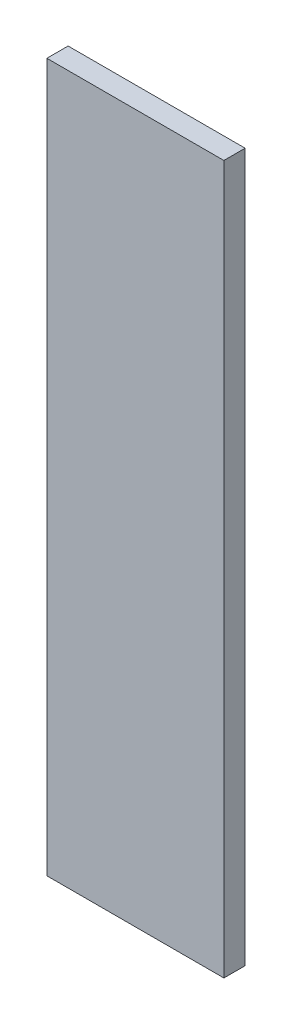
ISO-10303-21;
HEADER;
FILE_DESCRIPTION(('STEP AP214'),'2;1');
FILE_NAME('part.step','',(''),(''),'','','');
FILE_SCHEMA(('AUTOMOTIVE_DESIGN { 1 0 10303 214 1 1 1 1 }'));
ENDSEC;
DATA;
#1=APPLICATION_CONTEXT('core data for automotive mechanical design processes');
#2=APPLICATION_PROTOCOL_DEFINITION('international standard','automotive_design',2000,#1);
#3=PRODUCT_CONTEXT('',#1,'mechanical');
#4=PRODUCT('Part','Part','',(#3));
#5=PRODUCT_RELATED_PRODUCT_CATEGORY('part','',(#4));
#6=PRODUCT_DEFINITION_FORMATION('','',#4);
#7=PRODUCT_DEFINITION_CONTEXT('part definition',#1,'design');
#8=PRODUCT_DEFINITION('design','',#6,#7);
#9=PRODUCT_DEFINITION_SHAPE('','',#8);
#10=(LENGTH_UNIT() NAMED_UNIT(*) SI_UNIT(.MILLI.,.METRE.));
#11=(NAMED_UNIT(*) PLANE_ANGLE_UNIT() SI_UNIT($,.RADIAN.));
#12=(NAMED_UNIT(*) SI_UNIT($,.STERADIAN.) SOLID_ANGLE_UNIT());
#13=UNCERTAINTY_MEASURE_WITH_UNIT(LENGTH_MEASURE(1.E-05),#10,'distance_accuracy_value','');
#14=(GEOMETRIC_REPRESENTATION_CONTEXT(3) GLOBAL_UNCERTAINTY_ASSIGNED_CONTEXT((#13)) GLOBAL_UNIT_ASSIGNED_CONTEXT((#10,
#11,#12)) REPRESENTATION_CONTEXT('',''));
#15=CARTESIAN_POINT('',(0.,0.,0.));
#16=DIRECTION('',(0.,0.,1.));
#17=DIRECTION('',(1.,0.,0.));
#18=AXIS2_PLACEMENT_3D('',#15,#16,#17);
#19=CARTESIAN_POINT('',(500.,2000.,60.));
#20=DIRECTION('',(-1.,0.,0.));
#21=DIRECTION('',(0.,0.,1.));
#22=AXIS2_PLACEMENT_3D('',#19,#20,#21);
#23=PLANE('',#22);
#24=DIRECTION('',(0.,0.,-1.));
#25=VECTOR('',#24,1.);
#26=CARTESIAN_POINT('',(500.,-2000.,60.));
#27=LINE('',#26,#25);
#28=CARTESIAN_POINT('',(500.,-2000.,60.));
#29=VERTEX_POINT('',#28);
#30=CARTESIAN_POINT('',(500.,-2000.,-60.));
#31=VERTEX_POINT('',#30);
#32=EDGE_CURVE('E100',#29,#31,#27,.T.);
#33=ORIENTED_EDGE('',*,*,#32,.T.);
#34=DIRECTION('',(0.,-1.,0.));
#35=VECTOR('',#34,1.);
#36=CARTESIAN_POINT('',(500.,2000.,-60.));
#37=LINE('',#36,#35);
#38=CARTESIAN_POINT('',(500.,2000.,-60.));
#39=VERTEX_POINT('',#38);
#40=EDGE_CURVE('E11',#39,#31,#37,.T.);
#41=ORIENTED_EDGE('',*,*,#40,.F.);
#42=DIRECTION('',(0.,0.,-1.));
#43=VECTOR('',#42,1.);
#44=CARTESIAN_POINT('',(500.,2000.,60.));
#45=LINE('',#44,#43);
#46=CARTESIAN_POINT('',(500.,2000.,60.));
#47=VERTEX_POINT('',#46);
#48=EDGE_CURVE('E88',#47,#39,#45,.T.);
#49=ORIENTED_EDGE('',*,*,#48,.F.);
#50=DIRECTION('',(0.,-1.,0.));
#51=VECTOR('',#50,1.);
#52=CARTESIAN_POINT('',(500.,2000.,60.));
#53=LINE('',#52,#51);
#54=EDGE_CURVE('E96',#47,#29,#53,.T.);
#55=ORIENTED_EDGE('',*,*,#54,.T.);
#56=EDGE_LOOP('',(#33,#41,#49,#55));
#57=FACE_BOUND('',#56,.T.);
#58=ADVANCED_FACE('F37',(#57),#23,.F.);
#59=CARTESIAN_POINT('',(-500.,2000.,-60.));
#60=DIRECTION('',(0.,0.,1.));
#61=DIRECTION('',(1.,0.,0.));
#62=AXIS2_PLACEMENT_3D('',#59,#60,#61);
#63=PLANE('',#62);
#64=DIRECTION('',(-1.,0.,0.));
#65=VECTOR('',#64,1.);
#66=CARTESIAN_POINT('',(-500.,-2000.,-60.));
#67=LINE('',#66,#65);
#68=CARTESIAN_POINT('',(-500.,-2000.,-60.));
#69=VERTEX_POINT('',#68);
#70=EDGE_CURVE('E92',#31,#69,#67,.T.);
#71=ORIENTED_EDGE('',*,*,#70,.T.);
#72=DIRECTION('',(0.,-1.,0.));
#73=VECTOR('',#72,1.);
#74=CARTESIAN_POINT('',(-500.,2000.,-60.));
#75=LINE('',#74,#73);
#76=CARTESIAN_POINT('',(-500.,2000.,-60.));
#77=VERTEX_POINT('',#76);
#78=EDGE_CURVE('E45',#77,#69,#75,.T.);
#79=ORIENTED_EDGE('',*,*,#78,.F.);
#80=DIRECTION('',(-1.,0.,0.));
#81=VECTOR('',#80,1.);
#82=CARTESIAN_POINT('',(-500.,2000.,-60.));
#83=LINE('',#82,#81);
#84=EDGE_CURVE('E83',#39,#77,#83,.T.);
#85=ORIENTED_EDGE('',*,*,#84,.F.);
#86=ORIENTED_EDGE('',*,*,#40,.T.);
#87=EDGE_LOOP('',(#71,#79,#85,#86));
#88=FACE_BOUND('',#87,.T.);
#89=ADVANCED_FACE('F91',(#88),#63,.F.);
#90=CARTESIAN_POINT('',(-500.,2000.,60.));
#91=DIRECTION('',(1.,0.,0.));
#92=DIRECTION('',(0.,0.,-1.));
#93=AXIS2_PLACEMENT_3D('',#90,#91,#92);
#94=PLANE('',#93);
#95=DIRECTION('',(0.,0.,1.));
#96=VECTOR('',#95,1.);
#97=CARTESIAN_POINT('',(-500.,-2000.,60.));
#98=LINE('',#97,#96);
#99=CARTESIAN_POINT('',(-500.,-2000.,60.));
#100=VERTEX_POINT('',#99);
#101=EDGE_CURVE('E70',#69,#100,#98,.T.);
#102=ORIENTED_EDGE('',*,*,#101,.T.);
#103=DIRECTION('',(0.,-1.,0.));
#104=VECTOR('',#103,1.);
#105=CARTESIAN_POINT('',(-500.,2000.,60.));
#106=LINE('',#105,#104);
#107=CARTESIAN_POINT('',(-500.,2000.,60.));
#108=VERTEX_POINT('',#107);
#109=EDGE_CURVE('E93',#108,#100,#106,.T.);
#110=ORIENTED_EDGE('',*,*,#109,.F.);
#111=DIRECTION('',(0.,0.,1.));
#112=VECTOR('',#111,1.);
#113=CARTESIAN_POINT('',(-500.,2000.,60.));
#114=LINE('',#113,#112);
#115=EDGE_CURVE('E86',#77,#108,#114,.T.);
#116=ORIENTED_EDGE('',*,*,#115,.F.);
#117=ORIENTED_EDGE('',*,*,#78,.T.);
#118=EDGE_LOOP('',(#102,#110,#116,#117));
#119=FACE_BOUND('',#118,.T.);
#120=ADVANCED_FACE('F94',(#119),#94,.F.);
#121=CARTESIAN_POINT('',(-500.,2000.,60.));
#122=DIRECTION('',(0.,0.,-1.));
#123=DIRECTION('',(-1.,0.,0.));
#124=AXIS2_PLACEMENT_3D('',#121,#122,#123);
#125=PLANE('',#124);
#126=DIRECTION('',(1.,0.,0.));
#127=VECTOR('',#126,1.);
#128=CARTESIAN_POINT('',(-500.,-2000.,60.));
#129=LINE('',#128,#127);
#130=EDGE_CURVE('E76',#100,#29,#129,.T.);
#131=ORIENTED_EDGE('',*,*,#130,.T.);
#132=ORIENTED_EDGE('',*,*,#54,.F.);
#133=DIRECTION('',(1.,0.,0.));
#134=VECTOR('',#133,1.);
#135=CARTESIAN_POINT('',(-500.,2000.,60.));
#136=LINE('',#135,#134);
#137=EDGE_CURVE('E53',#108,#47,#136,.T.);
#138=ORIENTED_EDGE('',*,*,#137,.F.);
#139=ORIENTED_EDGE('',*,*,#109,.T.);
#140=EDGE_LOOP('',(#131,#132,#138,#139));
#141=FACE_BOUND('',#140,.T.);
#142=ADVANCED_FACE('F107',(#141),#125,.F.);
#143=CARTESIAN_POINT('',(0.,2000.,0.));
#144=DIRECTION('',(0.,-1.,0.));
#145=DIRECTION('',(0.,0.,-1.));
#146=AXIS2_PLACEMENT_3D('',#143,#144,#145);
#147=PLANE('',#146);
#148=ORIENTED_EDGE('',*,*,#48,.T.);
#149=ORIENTED_EDGE('',*,*,#84,.T.);
#150=ORIENTED_EDGE('',*,*,#115,.T.);
#151=ORIENTED_EDGE('',*,*,#137,.T.);
#152=EDGE_LOOP('',(#148,#149,#150,#151));
#153=FACE_BOUND('',#152,.T.);
#154=ADVANCED_FACE('F84',(#153),#147,.F.);
#155=CARTESIAN_POINT('',(0.,-2000.,0.));
#156=DIRECTION('',(0.,-1.,0.));
#157=DIRECTION('',(0.,0.,-1.));
#158=AXIS2_PLACEMENT_3D('',#155,#156,#157);
#159=PLANE('',#158);
#160=ORIENTED_EDGE('',*,*,#32,.F.);
#161=ORIENTED_EDGE('',*,*,#130,.F.);
#162=ORIENTED_EDGE('',*,*,#101,.F.);
#163=ORIENTED_EDGE('',*,*,#70,.F.);
#164=EDGE_LOOP('',(#160,#161,#162,#163));
#165=FACE_BOUND('',#164,.T.);
#166=ADVANCED_FACE('F110',(#165),#159,.T.);
#167=CLOSED_SHELL('',(#58,#89,#120,#142,#154,#166));
#168=MANIFOLD_SOLID_BREP('B2',#167);
#169=ADVANCED_BREP_SHAPE_REPRESENTATION('',(#18,#168),#14);
#170=SHAPE_DEFINITION_REPRESENTATION(#9,#169);
ENDSEC;
END-ISO-10303-21;
